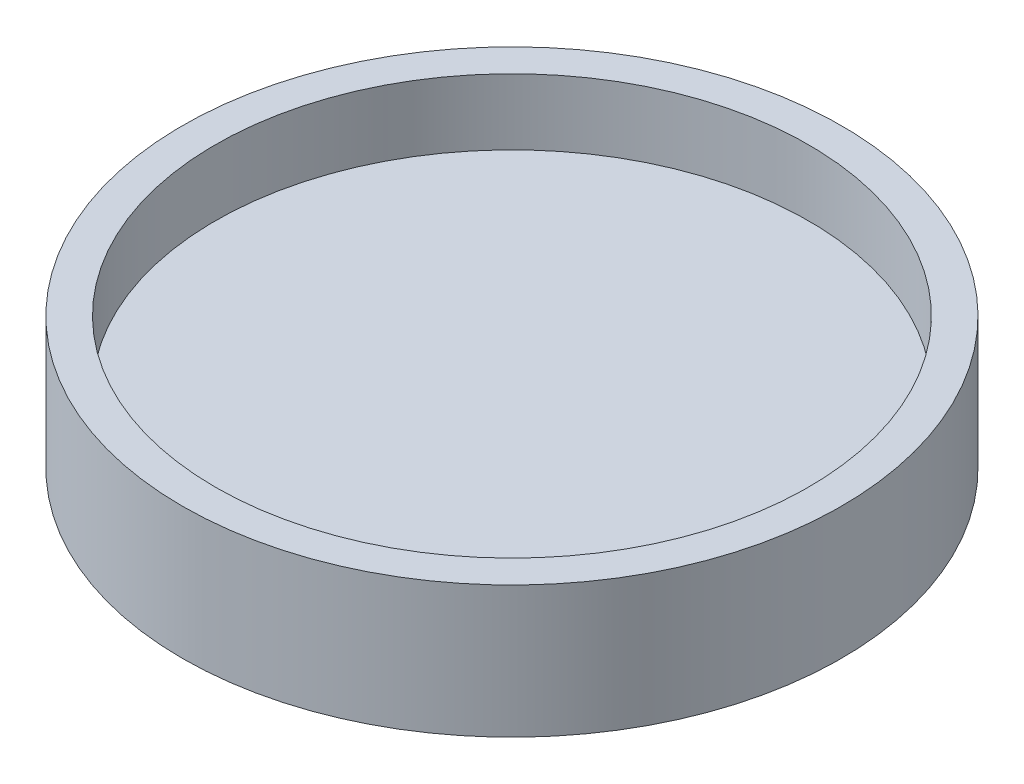
ISO-10303-21;
HEADER;
FILE_DESCRIPTION(('STEP AP214'),'2;1');
FILE_NAME('part.step','',(''),(''),'','','');
FILE_SCHEMA(('AUTOMOTIVE_DESIGN { 1 0 10303 214 1 1 1 1 }'));
ENDSEC;
DATA;
#1=APPLICATION_CONTEXT('core data for automotive mechanical design processes');
#2=APPLICATION_PROTOCOL_DEFINITION('international standard','automotive_design',2000,#1);
#3=PRODUCT_CONTEXT('',#1,'mechanical');
#4=PRODUCT('Part','Part','',(#3));
#5=PRODUCT_RELATED_PRODUCT_CATEGORY('part','',(#4));
#6=PRODUCT_DEFINITION_FORMATION('','',#4);
#7=PRODUCT_DEFINITION_CONTEXT('part definition',#1,'design');
#8=PRODUCT_DEFINITION('design','',#6,#7);
#9=PRODUCT_DEFINITION_SHAPE('','',#8);
#10=(LENGTH_UNIT() NAMED_UNIT(*) SI_UNIT(.MILLI.,.METRE.));
#11=(NAMED_UNIT(*) PLANE_ANGLE_UNIT() SI_UNIT($,.RADIAN.));
#12=(NAMED_UNIT(*) SI_UNIT($,.STERADIAN.) SOLID_ANGLE_UNIT());
#13=UNCERTAINTY_MEASURE_WITH_UNIT(LENGTH_MEASURE(1.E-05),#10,'distance_accuracy_value','');
#14=(GEOMETRIC_REPRESENTATION_CONTEXT(3) GLOBAL_UNCERTAINTY_ASSIGNED_CONTEXT((#13)) GLOBAL_UNIT_ASSIGNED_CONTEXT((#10,
#11,#12)) REPRESENTATION_CONTEXT('',''));
#15=CARTESIAN_POINT('',(0.,0.,0.));
#16=DIRECTION('',(0.,0.,1.));
#17=DIRECTION('',(1.,0.,0.));
#18=AXIS2_PLACEMENT_3D('',#15,#16,#17);
#19=CARTESIAN_POINT('',(0.,10.,0.));
#20=DIRECTION('',(0.,-1.,0.));
#21=DIRECTION('',(0.,0.,-1.));
#22=AXIS2_PLACEMENT_3D('',#19,#20,#21);
#23=CYLINDRICAL_SURFACE('',#22,25.);
#24=CARTESIAN_POINT('',(0.,10.,0.));
#25=DIRECTION('',(0.,1.,0.));
#26=DIRECTION('',(0.,0.,1.));
#27=AXIS2_PLACEMENT_3D('',#24,#25,#26);
#28=CIRCLE('',#27,25.);
#29=CARTESIAN_POINT('',(0.,10.,25.));
#30=VERTEX_POINT('',#29);
#31=EDGE_CURVE('E10',#30,#30,#28,.T.);
#32=ORIENTED_EDGE('',*,*,#31,.F.);
#33=EDGE_LOOP('',(#32));
#34=FACE_BOUND('',#33,.T.);
#35=CARTESIAN_POINT('',(0.,0.,0.));
#36=DIRECTION('',(0.,1.,0.));
#37=DIRECTION('',(0.,0.,1.));
#38=AXIS2_PLACEMENT_3D('',#35,#36,#37);
#39=CIRCLE('',#38,25.);
#40=CARTESIAN_POINT('',(0.,0.,25.));
#41=VERTEX_POINT('',#40);
#42=EDGE_CURVE('E34',#41,#41,#39,.T.);
#43=ORIENTED_EDGE('',*,*,#42,.T.);
#44=EDGE_LOOP('',(#43));
#45=FACE_BOUND('',#44,.T.);
#46=ADVANCED_FACE('F31',(#34,#45),#23,.T.);
#47=CARTESIAN_POINT('',(0.,10.,0.));
#48=DIRECTION('',(0.,1.,0.));
#49=DIRECTION('',(0.,0.,1.));
#50=AXIS2_PLACEMENT_3D('',#47,#48,#49);
#51=PLANE('',#50);
#52=CARTESIAN_POINT('',(0.,10.,0.));
#53=DIRECTION('',(0.,1.,0.));
#54=DIRECTION('',(0.,0.,1.));
#55=AXIS2_PLACEMENT_3D('',#52,#53,#54);
#56=CIRCLE('',#55,22.5);
#57=CARTESIAN_POINT('',(0.,10.,22.5));
#58=VERTEX_POINT('',#57);
#59=EDGE_CURVE('E43',#58,#58,#56,.T.);
#60=ORIENTED_EDGE('',*,*,#59,.F.);
#61=EDGE_LOOP('',(#60));
#62=FACE_BOUND('',#61,.T.);
#63=ORIENTED_EDGE('',*,*,#31,.T.);
#64=EDGE_LOOP('',(#63));
#65=FACE_BOUND('',#64,.T.);
#66=ADVANCED_FACE('F58',(#62,#65),#51,.T.);
#67=CARTESIAN_POINT('',(0.,0.,0.));
#68=DIRECTION('',(0.,1.,0.));
#69=DIRECTION('',(0.,0.,1.));
#70=AXIS2_PLACEMENT_3D('',#67,#68,#69);
#71=PLANE('',#70);
#72=ORIENTED_EDGE('',*,*,#42,.F.);
#73=EDGE_LOOP('',(#72));
#74=FACE_BOUND('',#73,.T.);
#75=ADVANCED_FACE('F54',(#74),#71,.F.);
#76=CARTESIAN_POINT('',(0.,5.,0.));
#77=DIRECTION('',(0.,1.,0.));
#78=DIRECTION('',(0.,0.,1.));
#79=AXIS2_PLACEMENT_3D('',#76,#77,#78);
#80=CYLINDRICAL_SURFACE('',#79,22.5);
#81=CARTESIAN_POINT('',(0.,5.,0.));
#82=DIRECTION('',(0.,1.,0.));
#83=DIRECTION('',(0.,0.,1.));
#84=AXIS2_PLACEMENT_3D('',#81,#82,#83);
#85=CIRCLE('',#84,22.5);
#86=CARTESIAN_POINT('',(0.,5.,22.5));
#87=VERTEX_POINT('',#86);
#88=EDGE_CURVE('E41',#87,#87,#85,.T.);
#89=ORIENTED_EDGE('',*,*,#88,.F.);
#90=EDGE_LOOP('',(#89));
#91=FACE_BOUND('',#90,.T.);
#92=ORIENTED_EDGE('',*,*,#59,.T.);
#93=EDGE_LOOP('',(#92));
#94=FACE_BOUND('',#93,.T.);
#95=ADVANCED_FACE('F51',(#91,#94),#80,.F.);
#96=CARTESIAN_POINT('',(0.,5.,0.));
#97=DIRECTION('',(0.,1.,0.));
#98=DIRECTION('',(0.,0.,1.));
#99=AXIS2_PLACEMENT_3D('',#96,#97,#98);
#100=PLANE('',#99);
#101=ORIENTED_EDGE('',*,*,#88,.T.);
#102=EDGE_LOOP('',(#101));
#103=FACE_BOUND('',#102,.T.);
#104=ADVANCED_FACE('F49',(#103),#100,.T.);
#105=CLOSED_SHELL('',(#46,#66,#75,#95,#104));
#106=MANIFOLD_SOLID_BREP('B2',#105);
#107=ADVANCED_BREP_SHAPE_REPRESENTATION('',(#18,#106),#14);
#108=SHAPE_DEFINITION_REPRESENTATION(#9,#107);
ENDSEC;
END-ISO-10303-21;
